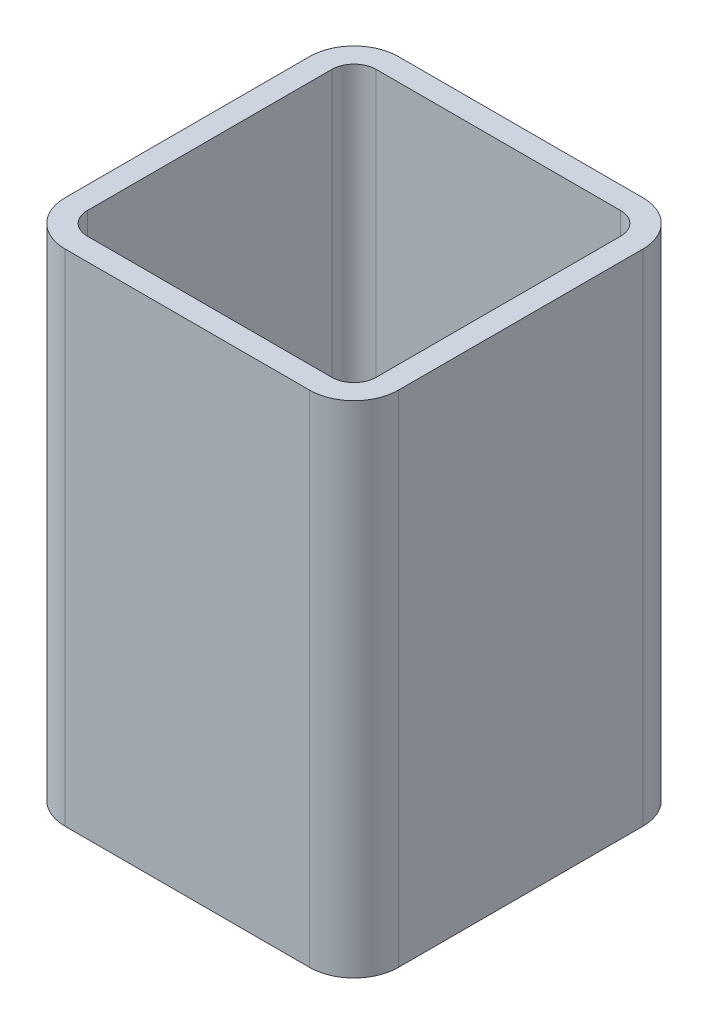
ISO-10303-21;
HEADER;
FILE_DESCRIPTION(('STEP AP214'),'2;1');
FILE_NAME('part.step','',(''),(''),'','','');
FILE_SCHEMA(('AUTOMOTIVE_DESIGN { 1 0 10303 214 1 1 1 1 }'));
ENDSEC;
DATA;
#1=APPLICATION_CONTEXT('core data for automotive mechanical design processes');
#2=APPLICATION_PROTOCOL_DEFINITION('international standard','automotive_design',2000,#1);
#3=PRODUCT_CONTEXT('',#1,'mechanical');
#4=PRODUCT('Part','Part','',(#3));
#5=PRODUCT_RELATED_PRODUCT_CATEGORY('part','',(#4));
#6=PRODUCT_DEFINITION_FORMATION('','',#4);
#7=PRODUCT_DEFINITION_CONTEXT('part definition',#1,'design');
#8=PRODUCT_DEFINITION('design','',#6,#7);
#9=PRODUCT_DEFINITION_SHAPE('','',#8);
#10=(LENGTH_UNIT() NAMED_UNIT(*) SI_UNIT(.MILLI.,.METRE.));
#11=(NAMED_UNIT(*) PLANE_ANGLE_UNIT() SI_UNIT($,.RADIAN.));
#12=(NAMED_UNIT(*) SI_UNIT($,.STERADIAN.) SOLID_ANGLE_UNIT());
#13=UNCERTAINTY_MEASURE_WITH_UNIT(LENGTH_MEASURE(1.E-05),#10,'distance_accuracy_value','');
#14=(GEOMETRIC_REPRESENTATION_CONTEXT(3) GLOBAL_UNCERTAINTY_ASSIGNED_CONTEXT((#13)) GLOBAL_UNIT_ASSIGNED_CONTEXT((#10,
#11,#12)) REPRESENTATION_CONTEXT('',''));
#15=CARTESIAN_POINT('',(0.,0.,0.));
#16=DIRECTION('',(0.,0.,1.));
#17=DIRECTION('',(1.,0.,0.));
#18=AXIS2_PLACEMENT_3D('',#15,#16,#17);
#19=CARTESIAN_POINT('',(4.,22.5,-4.));
#20=DIRECTION('',(0.,-1.,0.));
#21=DIRECTION('',(0.,0.,-1.));
#22=AXIS2_PLACEMENT_3D('',#19,#20,#21);
#23=PLANE('',#22);
#24=CARTESIAN_POINT('',(4.,22.5,-4.));
#25=DIRECTION('',(0.,1.,0.));
#26=DIRECTION('',(0.,0.,-1.));
#27=AXIS2_PLACEMENT_3D('',#24,#25,#26);
#28=CIRCLE('',#27,4.);
#29=CARTESIAN_POINT('',(0.,22.5,-4.00000000000003));
#30=VERTEX_POINT('',#29);
#31=CARTESIAN_POINT('',(4.00000000000003,22.5,0.));
#32=VERTEX_POINT('',#31);
#33=EDGE_CURVE('E213',#30,#32,#28,.T.);
#34=ORIENTED_EDGE('',*,*,#33,.T.);
#35=DIRECTION('',(1.,0.,0.));
#36=VECTOR('',#35,1.);
#37=CARTESIAN_POINT('',(4.00000000000003,22.5,0.));
#38=LINE('',#37,#36);
#39=CARTESIAN_POINT('',(26.,22.5,0.));
#40=VERTEX_POINT('',#39);
#41=EDGE_CURVE('E216',#32,#40,#38,.T.);
#42=ORIENTED_EDGE('',*,*,#41,.T.);
#43=CARTESIAN_POINT('',(26.,22.5,-4.));
#44=DIRECTION('',(0.,1.,0.));
#45=DIRECTION('',(0.,0.,1.));
#46=AXIS2_PLACEMENT_3D('',#43,#44,#45);
#47=CIRCLE('',#46,4.);
#48=CARTESIAN_POINT('',(30.,22.5,-4.00000000000003));
#49=VERTEX_POINT('',#48);
#50=EDGE_CURVE('E219',#40,#49,#47,.T.);
#51=ORIENTED_EDGE('',*,*,#50,.T.);
#52=DIRECTION('',(0.,0.,-1.));
#53=VECTOR('',#52,1.);
#54=CARTESIAN_POINT('',(30.,22.5,-4.00000000000003));
#55=LINE('',#54,#53);
#56=CARTESIAN_POINT('',(30.,22.5,-26.));
#57=VERTEX_POINT('',#56);
#58=EDGE_CURVE('E221',#49,#57,#55,.T.);
#59=ORIENTED_EDGE('',*,*,#58,.T.);
#60=CARTESIAN_POINT('',(26.,22.5,-26.));
#61=DIRECTION('',(0.,1.,0.));
#62=DIRECTION('',(0.,0.,-1.));
#63=AXIS2_PLACEMENT_3D('',#60,#61,#62);
#64=CIRCLE('',#63,4.);
#65=CARTESIAN_POINT('',(26.,22.5,-30.));
#66=VERTEX_POINT('',#65);
#67=EDGE_CURVE('E223',#57,#66,#64,.T.);
#68=ORIENTED_EDGE('',*,*,#67,.T.);
#69=DIRECTION('',(-1.,0.,0.));
#70=VECTOR('',#69,1.);
#71=CARTESIAN_POINT('',(4.00000000000003,22.5,-30.));
#72=LINE('',#71,#70);
#73=CARTESIAN_POINT('',(4.00000000000003,22.5,-30.));
#74=VERTEX_POINT('',#73);
#75=EDGE_CURVE('E225',#66,#74,#72,.T.);
#76=ORIENTED_EDGE('',*,*,#75,.T.);
#77=CARTESIAN_POINT('',(4.,22.5,-26.));
#78=DIRECTION('',(0.,1.,0.));
#79=DIRECTION('',(0.,0.,-1.));
#80=AXIS2_PLACEMENT_3D('',#77,#78,#79);
#81=CIRCLE('',#80,4.);
#82=CARTESIAN_POINT('',(0.,22.5,-26.));
#83=VERTEX_POINT('',#82);
#84=EDGE_CURVE('E227',#74,#83,#81,.T.);
#85=ORIENTED_EDGE('',*,*,#84,.T.);
#86=DIRECTION('',(0.,0.,1.));
#87=VECTOR('',#86,1.);
#88=CARTESIAN_POINT('',(0.,22.5,-4.00000000000003));
#89=LINE('',#88,#87);
#90=EDGE_CURVE('E229',#83,#30,#89,.T.);
#91=ORIENTED_EDGE('',*,*,#90,.T.);
#92=EDGE_LOOP('',(#34,#42,#51,#59,#68,#76,#85,#91));
#93=FACE_BOUND('',#92,.T.);
#94=CARTESIAN_POINT('',(4.,22.5,-4.));
#95=DIRECTION('',(0.,1.,0.));
#96=DIRECTION('',(0.,0.,-1.));
#97=AXIS2_PLACEMENT_3D('',#94,#95,#96);
#98=CIRCLE('',#97,2.);
#99=CARTESIAN_POINT('',(2.,22.5,-4.00000000000003));
#100=VERTEX_POINT('',#99);
#101=CARTESIAN_POINT('',(4.00000000000003,22.5,-2.));
#102=VERTEX_POINT('',#101);
#103=EDGE_CURVE('E148',#100,#102,#98,.T.);
#104=ORIENTED_EDGE('',*,*,#103,.F.);
#105=DIRECTION('',(0.,0.,1.));
#106=VECTOR('',#105,1.);
#107=CARTESIAN_POINT('',(2.,22.5,-4.00000000000003));
#108=LINE('',#107,#106);
#109=CARTESIAN_POINT('',(2.,22.5,-26.));
#110=VERTEX_POINT('',#109);
#111=EDGE_CURVE('E181',#110,#100,#108,.T.);
#112=ORIENTED_EDGE('',*,*,#111,.F.);
#113=CARTESIAN_POINT('',(4.,22.5,-26.));
#114=DIRECTION('',(0.,1.,0.));
#115=DIRECTION('',(0.,0.,-1.));
#116=AXIS2_PLACEMENT_3D('',#113,#114,#115);
#117=CIRCLE('',#116,2.);
#118=CARTESIAN_POINT('',(4.00000000000003,22.5,-28.));
#119=VERTEX_POINT('',#118);
#120=EDGE_CURVE('E179',#119,#110,#117,.T.);
#121=ORIENTED_EDGE('',*,*,#120,.F.);
#122=DIRECTION('',(-1.,0.,0.));
#123=VECTOR('',#122,1.);
#124=CARTESIAN_POINT('',(4.00000000000003,22.5,-28.));
#125=LINE('',#124,#123);
#126=CARTESIAN_POINT('',(26.,22.5,-28.));
#127=VERTEX_POINT('',#126);
#128=EDGE_CURVE('E177',#127,#119,#125,.T.);
#129=ORIENTED_EDGE('',*,*,#128,.F.);
#130=CARTESIAN_POINT('',(26.,22.5,-26.));
#131=DIRECTION('',(0.,1.,0.));
#132=DIRECTION('',(0.,0.,-1.));
#133=AXIS2_PLACEMENT_3D('',#130,#131,#132);
#134=CIRCLE('',#133,2.);
#135=CARTESIAN_POINT('',(28.,22.5,-26.));
#136=VERTEX_POINT('',#135);
#137=EDGE_CURVE('E175',#136,#127,#134,.T.);
#138=ORIENTED_EDGE('',*,*,#137,.F.);
#139=DIRECTION('',(0.,0.,-1.));
#140=VECTOR('',#139,1.);
#141=CARTESIAN_POINT('',(28.,22.5,-4.00000000000001));
#142=LINE('',#141,#140);
#143=CARTESIAN_POINT('',(28.,22.5,-4.00000000000001));
#144=VERTEX_POINT('',#143);
#145=EDGE_CURVE('E171',#144,#136,#142,.T.);
#146=ORIENTED_EDGE('',*,*,#145,.F.);
#147=CARTESIAN_POINT('',(26.,22.5,-4.));
#148=DIRECTION('',(0.,1.,0.));
#149=DIRECTION('',(0.,0.,1.));
#150=AXIS2_PLACEMENT_3D('',#147,#148,#149);
#151=CIRCLE('',#150,2.);
#152=CARTESIAN_POINT('',(26.,22.5,-2.));
#153=VERTEX_POINT('',#152);
#154=EDGE_CURVE('E169',#153,#144,#151,.T.);
#155=ORIENTED_EDGE('',*,*,#154,.F.);
#156=DIRECTION('',(1.,0.,0.));
#157=VECTOR('',#156,1.);
#158=CARTESIAN_POINT('',(4.00000000000003,22.5,-2.));
#159=LINE('',#158,#157);
#160=EDGE_CURVE('E156',#102,#153,#159,.T.);
#161=ORIENTED_EDGE('',*,*,#160,.F.);
#162=EDGE_LOOP('',(#104,#112,#121,#129,#138,#146,#155,#161));
#163=FACE_BOUND('',#162,.T.);
#164=ADVANCED_FACE('F35',(#93,#163),#23,.F.);
#165=CARTESIAN_POINT('',(4.,-22.5,-4.));
#166=DIRECTION('',(0.,-1.,0.));
#167=DIRECTION('',(0.,0.,-1.));
#168=AXIS2_PLACEMENT_3D('',#165,#166,#167);
#169=PLANE('',#168);
#170=CARTESIAN_POINT('',(4.,-22.5,-4.));
#171=DIRECTION('',(0.,1.,0.));
#172=DIRECTION('',(0.,0.,-1.));
#173=AXIS2_PLACEMENT_3D('',#170,#171,#172);
#174=CIRCLE('',#173,4.);
#175=CARTESIAN_POINT('',(0.,-22.5,-4.00000000000003));
#176=VERTEX_POINT('',#175);
#177=CARTESIAN_POINT('',(4.00000000000003,-22.5,0.));
#178=VERTEX_POINT('',#177);
#179=EDGE_CURVE('E164',#176,#178,#174,.T.);
#180=ORIENTED_EDGE('',*,*,#179,.F.);
#181=DIRECTION('',(0.,0.,1.));
#182=VECTOR('',#181,1.);
#183=CARTESIAN_POINT('',(0.,-22.5,-4.00000000000003));
#184=LINE('',#183,#182);
#185=CARTESIAN_POINT('',(0.,-22.5,-26.));
#186=VERTEX_POINT('',#185);
#187=EDGE_CURVE('E217',#186,#176,#184,.T.);
#188=ORIENTED_EDGE('',*,*,#187,.F.);
#189=CARTESIAN_POINT('',(4.,-22.5,-26.));
#190=DIRECTION('',(0.,1.,0.));
#191=DIRECTION('',(0.,0.,-1.));
#192=AXIS2_PLACEMENT_3D('',#189,#190,#191);
#193=CIRCLE('',#192,4.);
#194=CARTESIAN_POINT('',(4.00000000000003,-22.5,-30.));
#195=VERTEX_POINT('',#194);
#196=EDGE_CURVE('E244',#195,#186,#193,.T.);
#197=ORIENTED_EDGE('',*,*,#196,.F.);
#198=DIRECTION('',(-1.,0.,0.));
#199=VECTOR('',#198,1.);
#200=CARTESIAN_POINT('',(4.00000000000003,-22.5,-30.));
#201=LINE('',#200,#199);
#202=CARTESIAN_POINT('',(26.,-22.5,-30.));
#203=VERTEX_POINT('',#202);
#204=EDGE_CURVE('E242',#203,#195,#201,.T.);
#205=ORIENTED_EDGE('',*,*,#204,.F.);
#206=CARTESIAN_POINT('',(26.,-22.5,-26.));
#207=DIRECTION('',(0.,1.,0.));
#208=DIRECTION('',(0.,0.,-1.));
#209=AXIS2_PLACEMENT_3D('',#206,#207,#208);
#210=CIRCLE('',#209,4.);
#211=CARTESIAN_POINT('',(30.,-22.5,-26.));
#212=VERTEX_POINT('',#211);
#213=EDGE_CURVE('E240',#212,#203,#210,.T.);
#214=ORIENTED_EDGE('',*,*,#213,.F.);
#215=DIRECTION('',(0.,0.,-1.));
#216=VECTOR('',#215,1.);
#217=CARTESIAN_POINT('',(30.,-22.5,-4.00000000000003));
#218=LINE('',#217,#216);
#219=CARTESIAN_POINT('',(30.,-22.5,-4.00000000000003));
#220=VERTEX_POINT('',#219);
#221=EDGE_CURVE('E238',#220,#212,#218,.T.);
#222=ORIENTED_EDGE('',*,*,#221,.F.);
#223=CARTESIAN_POINT('',(26.,-22.5,-4.));
#224=DIRECTION('',(0.,1.,0.));
#225=DIRECTION('',(0.,0.,1.));
#226=AXIS2_PLACEMENT_3D('',#223,#224,#225);
#227=CIRCLE('',#226,4.);
#228=CARTESIAN_POINT('',(26.,-22.5,0.));
#229=VERTEX_POINT('',#228);
#230=EDGE_CURVE('E236',#229,#220,#227,.T.);
#231=ORIENTED_EDGE('',*,*,#230,.F.);
#232=DIRECTION('',(1.,0.,0.));
#233=VECTOR('',#232,1.);
#234=CARTESIAN_POINT('',(4.00000000000003,-22.5,0.));
#235=LINE('',#234,#233);
#236=EDGE_CURVE('E234',#178,#229,#235,.T.);
#237=ORIENTED_EDGE('',*,*,#236,.F.);
#238=EDGE_LOOP('',(#180,#188,#197,#205,#214,#222,#231,#237));
#239=FACE_BOUND('',#238,.T.);
#240=DIRECTION('',(0.,0.,1.));
#241=VECTOR('',#240,1.);
#242=CARTESIAN_POINT('',(2.,-22.5,-4.00000000000003));
#243=LINE('',#242,#241);
#244=CARTESIAN_POINT('',(2.,-22.5,-26.));
#245=VERTEX_POINT('',#244);
#246=CARTESIAN_POINT('',(2.,-22.5,-4.00000000000003));
#247=VERTEX_POINT('',#246);
#248=EDGE_CURVE('E157',#245,#247,#243,.T.);
#249=ORIENTED_EDGE('',*,*,#248,.T.);
#250=CARTESIAN_POINT('',(4.,-22.5,-4.));
#251=DIRECTION('',(0.,1.,0.));
#252=DIRECTION('',(0.,0.,-1.));
#253=AXIS2_PLACEMENT_3D('',#250,#251,#252);
#254=CIRCLE('',#253,2.);
#255=CARTESIAN_POINT('',(4.00000000000003,-22.5,-2.));
#256=VERTEX_POINT('',#255);
#257=EDGE_CURVE('E58',#247,#256,#254,.T.);
#258=ORIENTED_EDGE('',*,*,#257,.T.);
#259=DIRECTION('',(1.,0.,0.));
#260=VECTOR('',#259,1.);
#261=CARTESIAN_POINT('',(4.00000000000003,-22.5,-2.));
#262=LINE('',#261,#260);
#263=CARTESIAN_POINT('',(26.,-22.5,-2.));
#264=VERTEX_POINT('',#263);
#265=EDGE_CURVE('E163',#256,#264,#262,.T.);
#266=ORIENTED_EDGE('',*,*,#265,.T.);
#267=CARTESIAN_POINT('',(26.,-22.5,-4.));
#268=DIRECTION('',(0.,1.,0.));
#269=DIRECTION('',(0.,0.,1.));
#270=AXIS2_PLACEMENT_3D('',#267,#268,#269);
#271=CIRCLE('',#270,2.);
#272=CARTESIAN_POINT('',(28.,-22.5,-4.00000000000001));
#273=VERTEX_POINT('',#272);
#274=EDGE_CURVE('E185',#264,#273,#271,.T.);
#275=ORIENTED_EDGE('',*,*,#274,.T.);
#276=DIRECTION('',(0.,0.,-1.));
#277=VECTOR('',#276,1.);
#278=CARTESIAN_POINT('',(28.,-22.5,-4.00000000000001));
#279=LINE('',#278,#277);
#280=CARTESIAN_POINT('',(28.,-22.5,-26.));
#281=VERTEX_POINT('',#280);
#282=EDGE_CURVE('E188',#273,#281,#279,.T.);
#283=ORIENTED_EDGE('',*,*,#282,.T.);
#284=CARTESIAN_POINT('',(26.,-22.5,-26.));
#285=DIRECTION('',(0.,1.,0.));
#286=DIRECTION('',(0.,0.,-1.));
#287=AXIS2_PLACEMENT_3D('',#284,#285,#286);
#288=CIRCLE('',#287,2.);
#289=CARTESIAN_POINT('',(26.,-22.5,-28.));
#290=VERTEX_POINT('',#289);
#291=EDGE_CURVE('E191',#281,#290,#288,.T.);
#292=ORIENTED_EDGE('',*,*,#291,.T.);
#293=DIRECTION('',(-1.,0.,0.));
#294=VECTOR('',#293,1.);
#295=CARTESIAN_POINT('',(4.00000000000003,-22.5,-28.));
#296=LINE('',#295,#294);
#297=CARTESIAN_POINT('',(4.00000000000003,-22.5,-28.));
#298=VERTEX_POINT('',#297);
#299=EDGE_CURVE('E194',#290,#298,#296,.T.);
#300=ORIENTED_EDGE('',*,*,#299,.T.);
#301=CARTESIAN_POINT('',(4.,-22.5,-26.));
#302=DIRECTION('',(0.,1.,0.));
#303=DIRECTION('',(0.,0.,-1.));
#304=AXIS2_PLACEMENT_3D('',#301,#302,#303);
#305=CIRCLE('',#304,2.);
#306=EDGE_CURVE('E197',#298,#245,#305,.T.);
#307=ORIENTED_EDGE('',*,*,#306,.T.);
#308=EDGE_LOOP('',(#249,#258,#266,#275,#283,#292,#300,#307));
#309=FACE_BOUND('',#308,.T.);
#310=ADVANCED_FACE('F274',(#239,#309),#169,.T.);
#311=CARTESIAN_POINT('',(4.,22.5,-4.));
#312=DIRECTION('',(0.,-1.,0.));
#313=DIRECTION('',(0.,0.,-1.));
#314=AXIS2_PLACEMENT_3D('',#311,#312,#313);
#315=CYLINDRICAL_SURFACE('',#314,4.);
#316=ORIENTED_EDGE('',*,*,#179,.T.);
#317=DIRECTION('',(0.,-1.,0.));
#318=VECTOR('',#317,1.);
#319=CARTESIAN_POINT('',(4.00000000000003,22.5,0.));
#320=LINE('',#319,#318);
#321=EDGE_CURVE('E11',#32,#178,#320,.T.);
#322=ORIENTED_EDGE('',*,*,#321,.F.);
#323=ORIENTED_EDGE('',*,*,#33,.F.);
#324=DIRECTION('',(0.,-1.,0.));
#325=VECTOR('',#324,1.);
#326=CARTESIAN_POINT('',(0.,22.5,-4.00000000000003));
#327=LINE('',#326,#325);
#328=EDGE_CURVE('E231',#30,#176,#327,.T.);
#329=ORIENTED_EDGE('',*,*,#328,.T.);
#330=EDGE_LOOP('',(#316,#322,#323,#329));
#331=FACE_BOUND('',#330,.T.);
#332=ADVANCED_FACE('F37',(#331),#315,.T.);
#333=CARTESIAN_POINT('',(4.00000000000003,22.5,0.));
#334=DIRECTION('',(0.,0.,-1.));
#335=DIRECTION('',(-1.,0.,0.));
#336=AXIS2_PLACEMENT_3D('',#333,#334,#335);
#337=PLANE('',#336);
#338=ORIENTED_EDGE('',*,*,#236,.T.);
#339=DIRECTION('',(0.,-1.,0.));
#340=VECTOR('',#339,1.);
#341=CARTESIAN_POINT('',(26.,22.5,0.));
#342=LINE('',#341,#340);
#343=EDGE_CURVE('E43',#40,#229,#342,.T.);
#344=ORIENTED_EDGE('',*,*,#343,.F.);
#345=ORIENTED_EDGE('',*,*,#41,.F.);
#346=ORIENTED_EDGE('',*,*,#321,.T.);
#347=EDGE_LOOP('',(#338,#344,#345,#346));
#348=FACE_BOUND('',#347,.T.);
#349=ADVANCED_FACE('F291',(#348),#337,.F.);
#350=CARTESIAN_POINT('',(26.,22.5,-4.));
#351=DIRECTION('',(0.,-1.,0.));
#352=DIRECTION('',(0.,0.,-1.));
#353=AXIS2_PLACEMENT_3D('',#350,#351,#352);
#354=CYLINDRICAL_SURFACE('',#353,4.);
#355=ORIENTED_EDGE('',*,*,#230,.T.);
#356=DIRECTION('',(0.,-1.,0.));
#357=VECTOR('',#356,1.);
#358=CARTESIAN_POINT('',(30.,22.5,-4.00000000000003));
#359=LINE('',#358,#357);
#360=EDGE_CURVE('E261',#49,#220,#359,.T.);
#361=ORIENTED_EDGE('',*,*,#360,.F.);
#362=ORIENTED_EDGE('',*,*,#50,.F.);
#363=ORIENTED_EDGE('',*,*,#343,.T.);
#364=EDGE_LOOP('',(#355,#361,#362,#363));
#365=FACE_BOUND('',#364,.T.);
#366=ADVANCED_FACE('F268',(#365),#354,.T.);
#367=CARTESIAN_POINT('',(30.,22.5,-4.00000000000003));
#368=DIRECTION('',(-1.,0.,0.));
#369=DIRECTION('',(0.,0.,1.));
#370=AXIS2_PLACEMENT_3D('',#367,#368,#369);
#371=PLANE('',#370);
#372=ORIENTED_EDGE('',*,*,#221,.T.);
#373=DIRECTION('',(0.,-1.,0.));
#374=VECTOR('',#373,1.);
#375=CARTESIAN_POINT('',(30.,22.5,-26.));
#376=LINE('',#375,#374);
#377=EDGE_CURVE('E258',#57,#212,#376,.T.);
#378=ORIENTED_EDGE('',*,*,#377,.F.);
#379=ORIENTED_EDGE('',*,*,#58,.F.);
#380=ORIENTED_EDGE('',*,*,#360,.T.);
#381=EDGE_LOOP('',(#372,#378,#379,#380));
#382=FACE_BOUND('',#381,.T.);
#383=ADVANCED_FACE('F280',(#382),#371,.F.);
#384=CARTESIAN_POINT('',(26.,22.5,-26.));
#385=DIRECTION('',(0.,-1.,0.));
#386=DIRECTION('',(0.,0.,-1.));
#387=AXIS2_PLACEMENT_3D('',#384,#385,#386);
#388=CYLINDRICAL_SURFACE('',#387,4.);
#389=ORIENTED_EDGE('',*,*,#213,.T.);
#390=DIRECTION('',(0.,-1.,0.));
#391=VECTOR('',#390,1.);
#392=CARTESIAN_POINT('',(26.,22.5,-30.));
#393=LINE('',#392,#391);
#394=EDGE_CURVE('E255',#66,#203,#393,.T.);
#395=ORIENTED_EDGE('',*,*,#394,.F.);
#396=ORIENTED_EDGE('',*,*,#67,.F.);
#397=ORIENTED_EDGE('',*,*,#377,.T.);
#398=EDGE_LOOP('',(#389,#395,#396,#397));
#399=FACE_BOUND('',#398,.T.);
#400=ADVANCED_FACE('F284',(#399),#388,.T.);
#401=CARTESIAN_POINT('',(4.00000000000003,22.5,-30.));
#402=DIRECTION('',(0.,0.,1.));
#403=DIRECTION('',(1.,0.,0.));
#404=AXIS2_PLACEMENT_3D('',#401,#402,#403);
#405=PLANE('',#404);
#406=ORIENTED_EDGE('',*,*,#204,.T.);
#407=DIRECTION('',(0.,-1.,0.));
#408=VECTOR('',#407,1.);
#409=CARTESIAN_POINT('',(4.00000000000003,22.5,-30.));
#410=LINE('',#409,#408);
#411=EDGE_CURVE('E252',#74,#195,#410,.T.);
#412=ORIENTED_EDGE('',*,*,#411,.F.);
#413=ORIENTED_EDGE('',*,*,#75,.F.);
#414=ORIENTED_EDGE('',*,*,#394,.T.);
#415=EDGE_LOOP('',(#406,#412,#413,#414));
#416=FACE_BOUND('',#415,.T.);
#417=ADVANCED_FACE('F304',(#416),#405,.F.);
#418=CARTESIAN_POINT('',(4.,22.5,-26.));
#419=DIRECTION('',(0.,-1.,0.));
#420=DIRECTION('',(0.,0.,-1.));
#421=AXIS2_PLACEMENT_3D('',#418,#419,#420);
#422=CYLINDRICAL_SURFACE('',#421,4.);
#423=ORIENTED_EDGE('',*,*,#196,.T.);
#424=DIRECTION('',(0.,-1.,0.));
#425=VECTOR('',#424,1.);
#426=CARTESIAN_POINT('',(0.,22.5,-26.));
#427=LINE('',#426,#425);
#428=EDGE_CURVE('E249',#83,#186,#427,.T.);
#429=ORIENTED_EDGE('',*,*,#428,.F.);
#430=ORIENTED_EDGE('',*,*,#84,.F.);
#431=ORIENTED_EDGE('',*,*,#411,.T.);
#432=EDGE_LOOP('',(#423,#429,#430,#431));
#433=FACE_BOUND('',#432,.T.);
#434=ADVANCED_FACE('F302',(#433),#422,.T.);
#435=CARTESIAN_POINT('',(0.,22.5,-4.00000000000003));
#436=DIRECTION('',(1.,0.,0.));
#437=DIRECTION('',(0.,0.,-1.));
#438=AXIS2_PLACEMENT_3D('',#435,#436,#437);
#439=PLANE('',#438);
#440=ORIENTED_EDGE('',*,*,#187,.T.);
#441=ORIENTED_EDGE('',*,*,#328,.F.);
#442=ORIENTED_EDGE('',*,*,#90,.F.);
#443=ORIENTED_EDGE('',*,*,#428,.T.);
#444=EDGE_LOOP('',(#440,#441,#442,#443));
#445=FACE_BOUND('',#444,.T.);
#446=ADVANCED_FACE('F297',(#445),#439,.F.);
#447=CARTESIAN_POINT('',(4.,22.5,-4.));
#448=DIRECTION('',(0.,-1.,0.));
#449=DIRECTION('',(0.,0.,-1.));
#450=AXIS2_PLACEMENT_3D('',#447,#448,#449);
#451=CYLINDRICAL_SURFACE('',#450,2.);
#452=ORIENTED_EDGE('',*,*,#257,.F.);
#453=DIRECTION('',(0.,-1.,0.));
#454=VECTOR('',#453,1.);
#455=CARTESIAN_POINT('',(2.,22.5,-4.00000000000003));
#456=LINE('',#455,#454);
#457=EDGE_CURVE('E152',#100,#247,#456,.T.);
#458=ORIENTED_EDGE('',*,*,#457,.F.);
#459=ORIENTED_EDGE('',*,*,#103,.T.);
#460=DIRECTION('',(0.,-1.,0.));
#461=VECTOR('',#460,1.);
#462=CARTESIAN_POINT('',(4.00000000000003,22.5,-2.));
#463=LINE('',#462,#461);
#464=EDGE_CURVE('E151',#102,#256,#463,.T.);
#465=ORIENTED_EDGE('',*,*,#464,.T.);
#466=EDGE_LOOP('',(#452,#458,#459,#465));
#467=FACE_BOUND('',#466,.T.);
#468=ADVANCED_FACE('F150',(#467),#451,.F.);
#469=CARTESIAN_POINT('',(4.00000000000003,22.5,-2.));
#470=DIRECTION('',(0.,0.,-1.));
#471=DIRECTION('',(-1.,0.,0.));
#472=AXIS2_PLACEMENT_3D('',#469,#470,#471);
#473=PLANE('',#472);
#474=ORIENTED_EDGE('',*,*,#265,.F.);
#475=ORIENTED_EDGE('',*,*,#464,.F.);
#476=ORIENTED_EDGE('',*,*,#160,.T.);
#477=DIRECTION('',(0.,-1.,0.));
#478=VECTOR('',#477,1.);
#479=CARTESIAN_POINT('',(26.,22.5,-2.));
#480=LINE('',#479,#478);
#481=EDGE_CURVE('E165',#153,#264,#480,.T.);
#482=ORIENTED_EDGE('',*,*,#481,.T.);
#483=EDGE_LOOP('',(#474,#475,#476,#482));
#484=FACE_BOUND('',#483,.T.);
#485=ADVANCED_FACE('F160',(#484),#473,.T.);
#486=CARTESIAN_POINT('',(26.,22.5,-4.));
#487=DIRECTION('',(0.,-1.,0.));
#488=DIRECTION('',(0.,0.,-1.));
#489=AXIS2_PLACEMENT_3D('',#486,#487,#488);
#490=CYLINDRICAL_SURFACE('',#489,2.);
#491=ORIENTED_EDGE('',*,*,#274,.F.);
#492=ORIENTED_EDGE('',*,*,#481,.F.);
#493=ORIENTED_EDGE('',*,*,#154,.T.);
#494=DIRECTION('',(0.,-1.,0.));
#495=VECTOR('',#494,1.);
#496=CARTESIAN_POINT('',(28.,22.5,-4.00000000000001));
#497=LINE('',#496,#495);
#498=EDGE_CURVE('E210',#144,#273,#497,.T.);
#499=ORIENTED_EDGE('',*,*,#498,.T.);
#500=EDGE_LOOP('',(#491,#492,#493,#499));
#501=FACE_BOUND('',#500,.T.);
#502=ADVANCED_FACE('F329',(#501),#490,.F.);
#503=CARTESIAN_POINT('',(28.,22.5,-4.00000000000001));
#504=DIRECTION('',(-1.,0.,0.));
#505=DIRECTION('',(0.,0.,1.));
#506=AXIS2_PLACEMENT_3D('',#503,#504,#505);
#507=PLANE('',#506);
#508=ORIENTED_EDGE('',*,*,#282,.F.);
#509=ORIENTED_EDGE('',*,*,#498,.F.);
#510=ORIENTED_EDGE('',*,*,#145,.T.);
#511=DIRECTION('',(0.,-1.,0.));
#512=VECTOR('',#511,1.);
#513=CARTESIAN_POINT('',(28.,22.5,-26.));
#514=LINE('',#513,#512);
#515=EDGE_CURVE('E208',#136,#281,#514,.T.);
#516=ORIENTED_EDGE('',*,*,#515,.T.);
#517=EDGE_LOOP('',(#508,#509,#510,#516));
#518=FACE_BOUND('',#517,.T.);
#519=ADVANCED_FACE('F333',(#518),#507,.T.);
#520=CARTESIAN_POINT('',(26.,22.5,-26.));
#521=DIRECTION('',(0.,-1.,0.));
#522=DIRECTION('',(0.,0.,-1.));
#523=AXIS2_PLACEMENT_3D('',#520,#521,#522);
#524=CYLINDRICAL_SURFACE('',#523,2.);
#525=ORIENTED_EDGE('',*,*,#291,.F.);
#526=ORIENTED_EDGE('',*,*,#515,.F.);
#527=ORIENTED_EDGE('',*,*,#137,.T.);
#528=DIRECTION('',(0.,-1.,0.));
#529=VECTOR('',#528,1.);
#530=CARTESIAN_POINT('',(26.,22.5,-28.));
#531=LINE('',#530,#529);
#532=EDGE_CURVE('E206',#127,#290,#531,.T.);
#533=ORIENTED_EDGE('',*,*,#532,.T.);
#534=EDGE_LOOP('',(#525,#526,#527,#533));
#535=FACE_BOUND('',#534,.T.);
#536=ADVANCED_FACE('F339',(#535),#524,.F.);
#537=CARTESIAN_POINT('',(4.00000000000003,22.5,-28.));
#538=DIRECTION('',(0.,0.,1.));
#539=DIRECTION('',(1.,0.,0.));
#540=AXIS2_PLACEMENT_3D('',#537,#538,#539);
#541=PLANE('',#540);
#542=ORIENTED_EDGE('',*,*,#299,.F.);
#543=ORIENTED_EDGE('',*,*,#532,.F.);
#544=ORIENTED_EDGE('',*,*,#128,.T.);
#545=DIRECTION('',(0.,-1.,0.));
#546=VECTOR('',#545,1.);
#547=CARTESIAN_POINT('',(4.00000000000003,22.5,-28.));
#548=LINE('',#547,#546);
#549=EDGE_CURVE('E204',#119,#298,#548,.T.);
#550=ORIENTED_EDGE('',*,*,#549,.T.);
#551=EDGE_LOOP('',(#542,#543,#544,#550));
#552=FACE_BOUND('',#551,.T.);
#553=ADVANCED_FACE('F343',(#552),#541,.T.);
#554=CARTESIAN_POINT('',(4.,22.5,-26.));
#555=DIRECTION('',(0.,-1.,0.));
#556=DIRECTION('',(0.,0.,-1.));
#557=AXIS2_PLACEMENT_3D('',#554,#555,#556);
#558=CYLINDRICAL_SURFACE('',#557,2.);
#559=ORIENTED_EDGE('',*,*,#306,.F.);
#560=ORIENTED_EDGE('',*,*,#549,.F.);
#561=ORIENTED_EDGE('',*,*,#120,.T.);
#562=DIRECTION('',(0.,-1.,0.));
#563=VECTOR('',#562,1.);
#564=CARTESIAN_POINT('',(2.,22.5,-26.));
#565=LINE('',#564,#563);
#566=EDGE_CURVE('E50',#110,#245,#565,.T.);
#567=ORIENTED_EDGE('',*,*,#566,.T.);
#568=EDGE_LOOP('',(#559,#560,#561,#567));
#569=FACE_BOUND('',#568,.T.);
#570=ADVANCED_FACE('F347',(#569),#558,.F.);
#571=CARTESIAN_POINT('',(2.,22.5,-4.00000000000003));
#572=DIRECTION('',(1.,0.,0.));
#573=DIRECTION('',(0.,0.,-1.));
#574=AXIS2_PLACEMENT_3D('',#571,#572,#573);
#575=PLANE('',#574);
#576=ORIENTED_EDGE('',*,*,#248,.F.);
#577=ORIENTED_EDGE('',*,*,#566,.F.);
#578=ORIENTED_EDGE('',*,*,#111,.T.);
#579=ORIENTED_EDGE('',*,*,#457,.T.);
#580=EDGE_LOOP('',(#576,#577,#578,#579));
#581=FACE_BOUND('',#580,.T.);
#582=ADVANCED_FACE('F351',(#581),#575,.T.);
#583=CLOSED_SHELL('',(#164,#310,#332,#349,#366,#383,#400,#417,#434,#446,#468,#485,#502,#519,
#536,#553,#570,#582));
#584=MANIFOLD_SOLID_BREP('B2',#583);
#585=ADVANCED_BREP_SHAPE_REPRESENTATION('',(#18,#584),#14);
#586=SHAPE_DEFINITION_REPRESENTATION(#9,#585);
ENDSEC;
END-ISO-10303-21;
